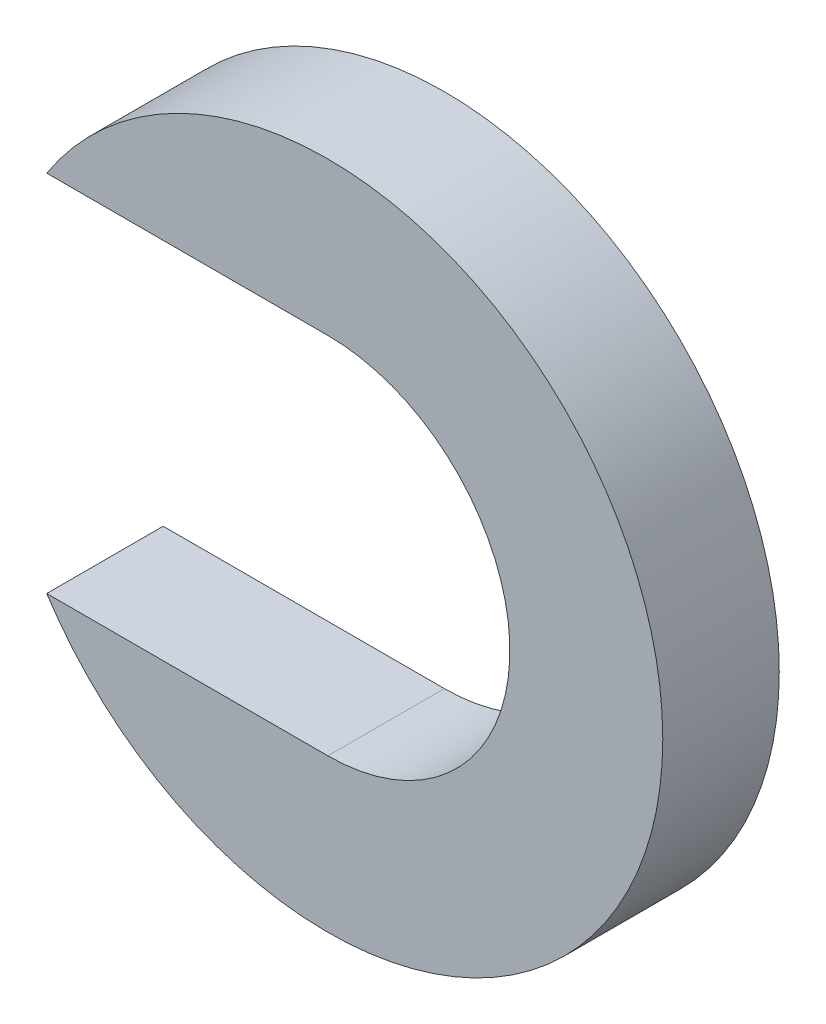
ISO-10303-21;
HEADER;
FILE_DESCRIPTION(('STEP AP214'),'2;1');
FILE_NAME('part.step','',(''),(''),'','','');
FILE_SCHEMA(('AUTOMOTIVE_DESIGN { 1 0 10303 214 1 1 1 1 }'));
ENDSEC;
DATA;
#1=APPLICATION_CONTEXT('core data for automotive mechanical design processes');
#2=APPLICATION_PROTOCOL_DEFINITION('international standard','automotive_design',2000,#1);
#3=PRODUCT_CONTEXT('',#1,'mechanical');
#4=PRODUCT('Part','Part','',(#3));
#5=PRODUCT_RELATED_PRODUCT_CATEGORY('part','',(#4));
#6=PRODUCT_DEFINITION_FORMATION('','',#4);
#7=PRODUCT_DEFINITION_CONTEXT('part definition',#1,'design');
#8=PRODUCT_DEFINITION('design','',#6,#7);
#9=PRODUCT_DEFINITION_SHAPE('','',#8);
#10=(LENGTH_UNIT() NAMED_UNIT(*) SI_UNIT(.MILLI.,.METRE.));
#11=(NAMED_UNIT(*) PLANE_ANGLE_UNIT() SI_UNIT($,.RADIAN.));
#12=(NAMED_UNIT(*) SI_UNIT($,.STERADIAN.) SOLID_ANGLE_UNIT());
#13=UNCERTAINTY_MEASURE_WITH_UNIT(LENGTH_MEASURE(1.E-05),#10,'distance_accuracy_value','');
#14=(GEOMETRIC_REPRESENTATION_CONTEXT(3) GLOBAL_UNCERTAINTY_ASSIGNED_CONTEXT((#13)) GLOBAL_UNIT_ASSIGNED_CONTEXT((#10,
#11,#12)) REPRESENTATION_CONTEXT('',''));
#15=CARTESIAN_POINT('',(0.,0.,0.));
#16=DIRECTION('',(0.,0.,1.));
#17=DIRECTION('',(1.,0.,0.));
#18=AXIS2_PLACEMENT_3D('',#15,#16,#17);
#19=CARTESIAN_POINT('',(0.,0.,3.175));
#20=DIRECTION('',(0.,0.,-1.));
#21=DIRECTION('',(-1.,0.,0.));
#22=AXIS2_PLACEMENT_3D('',#19,#20,#21);
#23=CYLINDRICAL_SURFACE('',#22,9.128125);
#24=CARTESIAN_POINT('',(0.,0.,3.175));
#25=DIRECTION('',(0.,0.,1.));
#26=DIRECTION('',(1.,0.,0.));
#27=AXIS2_PLACEMENT_3D('',#24,#25,#26);
#28=CIRCLE('',#27,9.128125);
#29=CARTESIAN_POINT('',(-7.66236028497216,-4.9609375,3.175));
#30=VERTEX_POINT('',#29);
#31=CARTESIAN_POINT('',(-7.66236028497216,4.9609375,3.175));
#32=VERTEX_POINT('',#31);
#33=EDGE_CURVE('E11',#30,#32,#28,.T.);
#34=ORIENTED_EDGE('',*,*,#33,.F.);
#35=DIRECTION('',(0.,0.,1.));
#36=VECTOR('',#35,1.);
#37=CARTESIAN_POINT('',(-7.66236028497216,-4.9609375,0.));
#38=LINE('',#37,#36);
#39=CARTESIAN_POINT('',(-7.66236028497216,-4.9609375,0.));
#40=VERTEX_POINT('',#39);
#41=EDGE_CURVE('E98',#40,#30,#38,.T.);
#42=ORIENTED_EDGE('',*,*,#41,.F.);
#43=CARTESIAN_POINT('',(0.,0.,0.));
#44=DIRECTION('',(0.,0.,1.));
#45=DIRECTION('',(1.,0.,0.));
#46=AXIS2_PLACEMENT_3D('',#43,#44,#45);
#47=CIRCLE('',#46,9.128125);
#48=CARTESIAN_POINT('',(-7.66236028497217,4.9609375,0.));
#49=VERTEX_POINT('',#48);
#50=EDGE_CURVE('E35',#40,#49,#47,.T.);
#51=ORIENTED_EDGE('',*,*,#50,.T.);
#52=DIRECTION('',(0.,0.,1.));
#53=VECTOR('',#52,1.);
#54=CARTESIAN_POINT('',(-7.66236028497216,4.9609375,0.));
#55=LINE('',#54,#53);
#56=EDGE_CURVE('E46',#49,#32,#55,.T.);
#57=ORIENTED_EDGE('',*,*,#56,.T.);
#58=EDGE_LOOP('',(#34,#42,#51,#57));
#59=FACE_BOUND('',#58,.T.);
#60=ADVANCED_FACE('F32',(#59),#23,.T.);
#61=CARTESIAN_POINT('',(0.,0.,3.175));
#62=DIRECTION('',(0.,0.,1.));
#63=DIRECTION('',(1.,0.,0.));
#64=AXIS2_PLACEMENT_3D('',#61,#62,#63);
#65=PLANE('',#64);
#66=DIRECTION('',(1.,0.,0.));
#67=VECTOR('',#66,1.);
#68=CARTESIAN_POINT('',(0.,-4.9609375,3.175));
#69=LINE('',#68,#67);
#70=CARTESIAN_POINT('',(0.,-4.9609375,3.175));
#71=VERTEX_POINT('',#70);
#72=EDGE_CURVE('E89',#30,#71,#69,.T.);
#73=ORIENTED_EDGE('',*,*,#72,.F.);
#74=ORIENTED_EDGE('',*,*,#33,.T.);
#75=DIRECTION('',(-1.,0.,0.));
#76=VECTOR('',#75,1.);
#77=CARTESIAN_POINT('',(0.,4.9609375,3.175));
#78=LINE('',#77,#76);
#79=CARTESIAN_POINT('',(0.,4.9609375,3.175));
#80=VERTEX_POINT('',#79);
#81=EDGE_CURVE('E91',#80,#32,#78,.T.);
#82=ORIENTED_EDGE('',*,*,#81,.F.);
#83=CARTESIAN_POINT('',(0.,0.,3.175));
#84=DIRECTION('',(0.,0.,1.));
#85=DIRECTION('',(1.,0.,0.));
#86=AXIS2_PLACEMENT_3D('',#83,#84,#85);
#87=CIRCLE('',#86,4.9609375);
#88=EDGE_CURVE('E78',#71,#80,#87,.T.);
#89=ORIENTED_EDGE('',*,*,#88,.F.);
#90=EDGE_LOOP('',(#73,#74,#82,#89));
#91=FACE_BOUND('',#90,.T.);
#92=ADVANCED_FACE('F105',(#91),#65,.T.);
#93=CARTESIAN_POINT('',(0.,0.,0.));
#94=DIRECTION('',(0.,0.,1.));
#95=DIRECTION('',(1.,0.,0.));
#96=AXIS2_PLACEMENT_3D('',#93,#94,#95);
#97=PLANE('',#96);
#98=ORIENTED_EDGE('',*,*,#50,.F.);
#99=DIRECTION('',(1.,0.,0.));
#100=VECTOR('',#99,1.);
#101=CARTESIAN_POINT('',(0.,-4.9609375,0.));
#102=LINE('',#101,#100);
#103=CARTESIAN_POINT('',(0.,-4.9609375,0.));
#104=VERTEX_POINT('',#103);
#105=EDGE_CURVE('E80',#40,#104,#102,.T.);
#106=ORIENTED_EDGE('',*,*,#105,.T.);
#107=CARTESIAN_POINT('',(0.,0.,0.));
#108=DIRECTION('',(0.,0.,1.));
#109=DIRECTION('',(1.,0.,0.));
#110=AXIS2_PLACEMENT_3D('',#107,#108,#109);
#111=CIRCLE('',#110,4.9609375);
#112=CARTESIAN_POINT('',(0.,4.9609375,0.));
#113=VERTEX_POINT('',#112);
#114=EDGE_CURVE('E75',#104,#113,#111,.T.);
#115=ORIENTED_EDGE('',*,*,#114,.T.);
#116=DIRECTION('',(-1.,0.,0.));
#117=VECTOR('',#116,1.);
#118=CARTESIAN_POINT('',(0.,4.9609375,0.));
#119=LINE('',#118,#117);
#120=EDGE_CURVE('E82',#113,#49,#119,.T.);
#121=ORIENTED_EDGE('',*,*,#120,.T.);
#122=EDGE_LOOP('',(#98,#106,#115,#121));
#123=FACE_BOUND('',#122,.T.);
#124=ADVANCED_FACE('F88',(#123),#97,.F.);
#125=CARTESIAN_POINT('',(0.,0.,0.));
#126=DIRECTION('',(0.,0.,1.));
#127=DIRECTION('',(1.,0.,0.));
#128=AXIS2_PLACEMENT_3D('',#125,#126,#127);
#129=CYLINDRICAL_SURFACE('',#128,4.9609375);
#130=ORIENTED_EDGE('',*,*,#88,.T.);
#131=DIRECTION('',(0.,0.,1.));
#132=VECTOR('',#131,1.);
#133=CARTESIAN_POINT('',(0.,4.9609375,0.));
#134=LINE('',#133,#132);
#135=EDGE_CURVE('E72',#113,#80,#134,.T.);
#136=ORIENTED_EDGE('',*,*,#135,.F.);
#137=ORIENTED_EDGE('',*,*,#114,.F.);
#138=DIRECTION('',(0.,0.,1.));
#139=VECTOR('',#138,1.);
#140=CARTESIAN_POINT('',(0.,-4.9609375,0.));
#141=LINE('',#140,#139);
#142=EDGE_CURVE('E55',#104,#71,#141,.T.);
#143=ORIENTED_EDGE('',*,*,#142,.T.);
#144=EDGE_LOOP('',(#130,#136,#137,#143));
#145=FACE_BOUND('',#144,.T.);
#146=ADVANCED_FACE('F73',(#145),#129,.F.);
#147=CARTESIAN_POINT('',(0.,-4.9609375,0.));
#148=DIRECTION('',(0.,-1.,0.));
#149=DIRECTION('',(1.,0.,0.));
#150=AXIS2_PLACEMENT_3D('',#147,#148,#149);
#151=PLANE('',#150);
#152=ORIENTED_EDGE('',*,*,#72,.T.);
#153=ORIENTED_EDGE('',*,*,#142,.F.);
#154=ORIENTED_EDGE('',*,*,#105,.F.);
#155=ORIENTED_EDGE('',*,*,#41,.T.);
#156=EDGE_LOOP('',(#152,#153,#154,#155));
#157=FACE_BOUND('',#156,.T.);
#158=ADVANCED_FACE('F106',(#157),#151,.F.);
#159=CARTESIAN_POINT('',(0.,4.9609375,0.));
#160=DIRECTION('',(0.,1.,0.));
#161=DIRECTION('',(-1.,0.,0.));
#162=AXIS2_PLACEMENT_3D('',#159,#160,#161);
#163=PLANE('',#162);
#164=ORIENTED_EDGE('',*,*,#81,.T.);
#165=ORIENTED_EDGE('',*,*,#56,.F.);
#166=ORIENTED_EDGE('',*,*,#120,.F.);
#167=ORIENTED_EDGE('',*,*,#135,.T.);
#168=EDGE_LOOP('',(#164,#165,#166,#167));
#169=FACE_BOUND('',#168,.T.);
#170=ADVANCED_FACE('F83',(#169),#163,.F.);
#171=CLOSED_SHELL('',(#60,#92,#124,#146,#158,#170));
#172=MANIFOLD_SOLID_BREP('B2',#171);
#173=ADVANCED_BREP_SHAPE_REPRESENTATION('',(#18,#172),#14);
#174=SHAPE_DEFINITION_REPRESENTATION(#9,#173);
ENDSEC;
END-ISO-10303-21;
